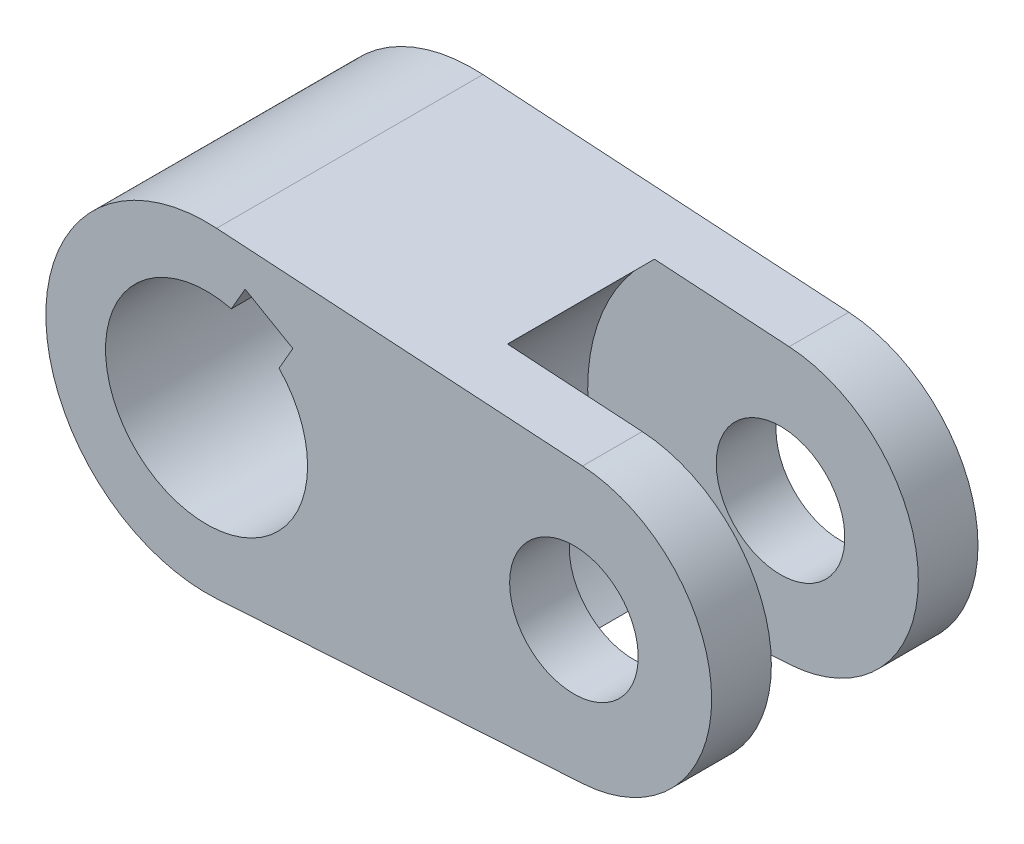
ISO-10303-21;
HEADER;
FILE_DESCRIPTION(('STEP AP214'),'2;1');
FILE_NAME('part.step','',(''),(''),'','','');
FILE_SCHEMA(('AUTOMOTIVE_DESIGN { 1 0 10303 214 1 1 1 1 }'));
ENDSEC;
DATA;
#1=APPLICATION_CONTEXT('core data for automotive mechanical design processes');
#2=APPLICATION_PROTOCOL_DEFINITION('international standard','automotive_design',2000,#1);
#3=PRODUCT_CONTEXT('',#1,'mechanical');
#4=PRODUCT('Part','Part','',(#3));
#5=PRODUCT_RELATED_PRODUCT_CATEGORY('part','',(#4));
#6=PRODUCT_DEFINITION_FORMATION('','',#4);
#7=PRODUCT_DEFINITION_CONTEXT('part definition',#1,'design');
#8=PRODUCT_DEFINITION('design','',#6,#7);
#9=PRODUCT_DEFINITION_SHAPE('','',#8);
#10=(LENGTH_UNIT() NAMED_UNIT(*) SI_UNIT(.MILLI.,.METRE.));
#11=(NAMED_UNIT(*) PLANE_ANGLE_UNIT() SI_UNIT($,.RADIAN.));
#12=(NAMED_UNIT(*) SI_UNIT($,.STERADIAN.) SOLID_ANGLE_UNIT());
#13=UNCERTAINTY_MEASURE_WITH_UNIT(LENGTH_MEASURE(1.E-05),#10,'distance_accuracy_value','');
#14=(GEOMETRIC_REPRESENTATION_CONTEXT(3) GLOBAL_UNCERTAINTY_ASSIGNED_CONTEXT((#13)) GLOBAL_UNIT_ASSIGNED_CONTEXT((#10,
#11,#12)) REPRESENTATION_CONTEXT('',''));
#15=CARTESIAN_POINT('',(0.,0.,0.));
#16=DIRECTION('',(0.,0.,1.));
#17=DIRECTION('',(1.,0.,0.));
#18=AXIS2_PLACEMENT_3D('',#15,#16,#17);
#19=CARTESIAN_POINT('',(40.,0.,14.5));
#20=DIRECTION('',(0.,0.,-1.));
#21=DIRECTION('',(-1.,0.,0.));
#22=AXIS2_PLACEMENT_3D('',#19,#20,#21);
#23=CYLINDRICAL_SURFACE('',#22,15.);
#24=CARTESIAN_POINT('',(40.,0.,-8.));
#25=DIRECTION('',(0.,0.,1.));
#26=DIRECTION('',(1.,0.,0.));
#27=AXIS2_PLACEMENT_3D('',#24,#25,#26);
#28=CIRCLE('',#27,15.);
#29=CARTESIAN_POINT('',(40.9375,-14.9706744587544,-8.));
#30=VERTEX_POINT('',#29);
#31=CARTESIAN_POINT('',(40.9375,14.9706744587544,-8.));
#32=VERTEX_POINT('',#31);
#33=EDGE_CURVE('E150',#30,#32,#28,.T.);
#34=ORIENTED_EDGE('',*,*,#33,.F.);
#35=DIRECTION('',(0.,0.,-1.));
#36=VECTOR('',#35,1.);
#37=CARTESIAN_POINT('',(40.9375,-14.9706744587544,14.5));
#38=LINE('',#37,#36);
#39=CARTESIAN_POINT('',(40.9375,-14.9706744587544,-14.5));
#40=VERTEX_POINT('',#39);
#41=EDGE_CURVE('E198',#30,#40,#38,.T.);
#42=ORIENTED_EDGE('',*,*,#41,.T.);
#43=CARTESIAN_POINT('',(40.,0.,-14.5));
#44=DIRECTION('',(0.,0.,1.));
#45=DIRECTION('',(1.,0.,0.));
#46=AXIS2_PLACEMENT_3D('',#43,#44,#45);
#47=CIRCLE('',#46,15.);
#48=CARTESIAN_POINT('',(40.9375,14.9706744587544,-14.5));
#49=VERTEX_POINT('',#48);
#50=EDGE_CURVE('E187',#40,#49,#47,.T.);
#51=ORIENTED_EDGE('',*,*,#50,.T.);
#52=DIRECTION('',(0.,0.,-1.));
#53=VECTOR('',#52,1.);
#54=CARTESIAN_POINT('',(40.9375,14.9706744587544,14.5));
#55=LINE('',#54,#53);
#56=EDGE_CURVE('E216',#32,#49,#55,.T.);
#57=ORIENTED_EDGE('',*,*,#56,.F.);
#58=EDGE_LOOP('',(#34,#42,#51,#57));
#59=FACE_BOUND('',#58,.T.);
#60=ADVANCED_FACE('F33',(#59),#23,.T.);
#61=CARTESIAN_POINT('',(40.9375,14.9706744587544,14.5));
#62=DIRECTION('',(-0.0625,-0.998044963916957,0.));
#63=DIRECTION('',(0.998044963916957,-0.0625,0.));
#64=AXIS2_PLACEMENT_3D('',#61,#62,#63);
#65=PLANE('',#64);
#66=DIRECTION('',(-0.998044963916957,0.0625,0.));
#67=VECTOR('',#66,1.);
#68=CARTESIAN_POINT('',(40.9375,14.9706744587544,-8.));
#69=LINE('',#68,#67);
#70=CARTESIAN_POINT('',(26.269294588294,15.889233112298,-8.));
#71=VERTEX_POINT('',#70);
#72=EDGE_CURVE('E133',#32,#71,#69,.T.);
#73=ORIENTED_EDGE('',*,*,#72,.F.);
#74=ORIENTED_EDGE('',*,*,#56,.T.);
#75=DIRECTION('',(-0.998044963916957,0.0625,0.));
#76=VECTOR('',#75,1.);
#77=CARTESIAN_POINT('',(40.9375,14.9706744587544,-14.5));
#78=LINE('',#77,#76);
#79=CARTESIAN_POINT('',(1.09375,17.4657868685467,-14.5));
#80=VERTEX_POINT('',#79);
#81=EDGE_CURVE('E201',#49,#80,#78,.T.);
#82=ORIENTED_EDGE('',*,*,#81,.T.);
#83=DIRECTION('',(0.,0.,-1.));
#84=VECTOR('',#83,1.);
#85=CARTESIAN_POINT('',(1.09375,17.4657868685467,14.5));
#86=LINE('',#85,#84);
#87=CARTESIAN_POINT('',(1.09375,17.4657868685467,14.5));
#88=VERTEX_POINT('',#87);
#89=EDGE_CURVE('E213',#88,#80,#86,.T.);
#90=ORIENTED_EDGE('',*,*,#89,.F.);
#91=DIRECTION('',(-0.998044963916957,0.0625,0.));
#92=VECTOR('',#91,1.);
#93=CARTESIAN_POINT('',(40.9375,14.9706744587544,14.5));
#94=LINE('',#93,#92);
#95=CARTESIAN_POINT('',(40.9375,14.9706744587544,14.5));
#96=VERTEX_POINT('',#95);
#97=EDGE_CURVE('E191',#96,#88,#94,.T.);
#98=ORIENTED_EDGE('',*,*,#97,.F.);
#99=CARTESIAN_POINT('',(40.9375,14.9706744587544,8.));
#100=VERTEX_POINT('',#99);
#101=EDGE_CURVE('E41',#96,#100,#55,.T.);
#102=ORIENTED_EDGE('',*,*,#101,.T.);
#103=DIRECTION('',(-0.998044963916957,0.0625,0.));
#104=VECTOR('',#103,1.);
#105=CARTESIAN_POINT('',(40.9375,14.9706744587544,8.));
#106=LINE('',#105,#104);
#107=CARTESIAN_POINT('',(26.269294588294,15.889233112298,8.));
#108=VERTEX_POINT('',#107);
#109=EDGE_CURVE('E136',#100,#108,#106,.T.);
#110=ORIENTED_EDGE('',*,*,#109,.T.);
#111=DIRECTION('',(0.,0.,1.));
#112=VECTOR('',#111,1.);
#113=CARTESIAN_POINT('',(26.2692945882941,15.889233112298,-8.));
#114=LINE('',#113,#112);
#115=EDGE_CURVE('E123',#108,#71,#114,.F.);
#116=ORIENTED_EDGE('',*,*,#115,.T.);
#117=EDGE_LOOP('',(#73,#74,#82,#90,#98,#102,#110,#116));
#118=FACE_BOUND('',#117,.T.);
#119=ADVANCED_FACE('F140',(#118),#65,.F.);
#120=CARTESIAN_POINT('',(40.9375,-14.9706744587544,14.5));
#121=DIRECTION('',(-0.0625000000000001,0.998044963916957,0.));
#122=DIRECTION('',(-0.998044963916957,-0.0625000000000001,0.));
#123=AXIS2_PLACEMENT_3D('',#120,#121,#122);
#124=PLANE('',#123);
#125=DIRECTION('',(0.998044963916957,0.0625000000000001,0.));
#126=VECTOR('',#125,1.);
#127=CARTESIAN_POINT('',(40.9375,-14.9706744587544,-8.));
#128=LINE('',#127,#126);
#129=CARTESIAN_POINT('',(26.2692945882941,-15.8892331122981,-8.));
#130=VERTEX_POINT('',#129);
#131=EDGE_CURVE('E145',#130,#30,#128,.T.);
#132=ORIENTED_EDGE('',*,*,#131,.F.);
#133=DIRECTION('',(0.,0.,1.));
#134=VECTOR('',#133,1.);
#135=CARTESIAN_POINT('',(26.2692945882941,-15.889233112298,-8.));
#136=LINE('',#135,#134);
#137=CARTESIAN_POINT('',(26.2692945882941,-15.8892331122981,8.));
#138=VERTEX_POINT('',#137);
#139=EDGE_CURVE('E11',#130,#138,#136,.T.);
#140=ORIENTED_EDGE('',*,*,#139,.T.);
#141=DIRECTION('',(0.998044963916957,0.0625000000000001,0.));
#142=VECTOR('',#141,1.);
#143=CARTESIAN_POINT('',(40.9375,-14.9706744587544,8.));
#144=LINE('',#143,#142);
#145=CARTESIAN_POINT('',(40.9375,-14.9706744587544,8.));
#146=VERTEX_POINT('',#145);
#147=EDGE_CURVE('E137',#138,#146,#144,.T.);
#148=ORIENTED_EDGE('',*,*,#147,.T.);
#149=CARTESIAN_POINT('',(40.9375,-14.9706744587544,14.5));
#150=VERTEX_POINT('',#149);
#151=EDGE_CURVE('E207',#150,#146,#38,.T.);
#152=ORIENTED_EDGE('',*,*,#151,.F.);
#153=DIRECTION('',(0.998044963916957,0.0625000000000001,0.));
#154=VECTOR('',#153,1.);
#155=CARTESIAN_POINT('',(40.9375,-14.9706744587544,14.5));
#156=LINE('',#155,#154);
#157=CARTESIAN_POINT('',(1.09374999999999,-17.4657868685468,14.5));
#158=VERTEX_POINT('',#157);
#159=EDGE_CURVE('E196',#158,#150,#156,.T.);
#160=ORIENTED_EDGE('',*,*,#159,.F.);
#161=DIRECTION('',(0.,0.,-1.));
#162=VECTOR('',#161,1.);
#163=CARTESIAN_POINT('',(1.09374999999999,-17.4657868685468,14.5));
#164=LINE('',#163,#162);
#165=CARTESIAN_POINT('',(1.09374999999999,-17.4657868685468,-14.5));
#166=VERTEX_POINT('',#165);
#167=EDGE_CURVE('E210',#158,#166,#164,.T.);
#168=ORIENTED_EDGE('',*,*,#167,.T.);
#169=DIRECTION('',(0.998044963916957,0.0625000000000001,0.));
#170=VECTOR('',#169,1.);
#171=CARTESIAN_POINT('',(40.9375,-14.9706744587544,-14.5));
#172=LINE('',#171,#170);
#173=EDGE_CURVE('E192',#166,#40,#172,.T.);
#174=ORIENTED_EDGE('',*,*,#173,.T.);
#175=ORIENTED_EDGE('',*,*,#41,.F.);
#176=EDGE_LOOP('',(#132,#140,#148,#152,#160,#168,#174,#175));
#177=FACE_BOUND('',#176,.T.);
#178=ADVANCED_FACE('F229',(#177),#124,.F.);
#179=CARTESIAN_POINT('',(40.,0.,14.5));
#180=DIRECTION('',(0.,0.,-1.));
#181=DIRECTION('',(-1.,0.,0.));
#182=AXIS2_PLACEMENT_3D('',#179,#180,#181);
#183=CYLINDRICAL_SURFACE('',#182,7.);
#184=CARTESIAN_POINT('',(40.,0.,-14.5));
#185=DIRECTION('',(0.,0.,1.));
#186=DIRECTION('',(1.,0.,0.));
#187=AXIS2_PLACEMENT_3D('',#184,#185,#186);
#188=CIRCLE('',#187,7.);
#189=CARTESIAN_POINT('',(33.,0.,-14.5));
#190=VERTEX_POINT('',#189);
#191=EDGE_CURVE('E132',#190,#190,#188,.T.);
#192=CARTESIAN_POINT('',(40.,0.,-8.));
#193=DIRECTION('',(0.,0.,1.));
#194=DIRECTION('',(1.,0.,0.));
#195=AXIS2_PLACEMENT_3D('',#192,#193,#194);
#196=CIRCLE('',#195,7.);
#197=CARTESIAN_POINT('',(33.,0.,-8.));
#198=VERTEX_POINT('',#197);
#199=EDGE_CURVE('E142',#198,#198,#196,.T.);
#200=CARTESIAN_POINT('',(33.,0.,-14.5));
#201=CARTESIAN_POINT('',(33.,0.,-14.4322916666667));
#202=CARTESIAN_POINT('',(33.,0.,-14.3645833333333));
#203=CARTESIAN_POINT('',(33.,0.,-14.2291666666667));
#204=CARTESIAN_POINT('',(33.,0.,-14.1614583333333));
#205=CARTESIAN_POINT('',(33.,0.,-14.0260416666667));
#206=CARTESIAN_POINT('',(33.,0.,-13.9583333333333));
#207=CARTESIAN_POINT('',(33.,0.,-13.8229166666667));
#208=CARTESIAN_POINT('',(33.,0.,-13.7552083333333));
#209=CARTESIAN_POINT('',(33.,0.,-13.6197916666667));
#210=CARTESIAN_POINT('',(33.,0.,-13.5520833333333));
#211=CARTESIAN_POINT('',(33.,0.,-13.4166666666667));
#212=CARTESIAN_POINT('',(33.,0.,-13.3489583333333));
#213=CARTESIAN_POINT('',(33.,0.,-13.2135416666667));
#214=CARTESIAN_POINT('',(33.,0.,-13.1458333333333));
#215=CARTESIAN_POINT('',(33.,0.,-13.0104166666667));
#216=CARTESIAN_POINT('',(33.,0.,-12.9427083333333));
#217=CARTESIAN_POINT('',(33.,0.,-12.8072916666667));
#218=CARTESIAN_POINT('',(33.,0.,-12.7395833333333));
#219=CARTESIAN_POINT('',(33.,0.,-12.6041666666667));
#220=CARTESIAN_POINT('',(33.,0.,-12.5364583333333));
#221=CARTESIAN_POINT('',(33.,0.,-12.4010416666667));
#222=CARTESIAN_POINT('',(33.,0.,-12.3333333333333));
#223=CARTESIAN_POINT('',(33.,0.,-12.1979166666667));
#224=CARTESIAN_POINT('',(33.,0.,-12.1302083333333));
#225=CARTESIAN_POINT('',(33.,0.,-11.9947916666667));
#226=CARTESIAN_POINT('',(33.,0.,-11.9270833333333));
#227=CARTESIAN_POINT('',(33.,0.,-11.7916666666667));
#228=CARTESIAN_POINT('',(33.,0.,-11.7239583333333));
#229=CARTESIAN_POINT('',(33.,0.,-11.5885416666667));
#230=CARTESIAN_POINT('',(33.,0.,-11.5208333333333));
#231=CARTESIAN_POINT('',(33.,0.,-11.3854166666667));
#232=CARTESIAN_POINT('',(33.,0.,-11.3177083333333));
#233=CARTESIAN_POINT('',(33.,0.,-11.1822916666667));
#234=CARTESIAN_POINT('',(33.,0.,-11.1145833333333));
#235=CARTESIAN_POINT('',(33.,0.,-10.9791666666667));
#236=CARTESIAN_POINT('',(33.,0.,-10.9114583333333));
#237=CARTESIAN_POINT('',(33.,0.,-10.7760416666667));
#238=CARTESIAN_POINT('',(33.,0.,-10.7083333333333));
#239=CARTESIAN_POINT('',(33.,0.,-10.5729166666667));
#240=CARTESIAN_POINT('',(33.,0.,-10.5052083333333));
#241=CARTESIAN_POINT('',(33.,0.,-10.3697916666667));
#242=CARTESIAN_POINT('',(33.,0.,-10.3020833333333));
#243=CARTESIAN_POINT('',(33.,0.,-10.1666666666667));
#244=CARTESIAN_POINT('',(33.,0.,-10.0989583333333));
#245=CARTESIAN_POINT('',(33.,0.,-9.96354166666667));
#246=CARTESIAN_POINT('',(33.,0.,-9.89583333333333));
#247=CARTESIAN_POINT('',(33.,0.,-9.76041666666667));
#248=CARTESIAN_POINT('',(33.,0.,-9.69270833333334));
#249=CARTESIAN_POINT('',(33.,0.,-9.55729166666667));
#250=CARTESIAN_POINT('',(33.,0.,-9.48958333333334));
#251=CARTESIAN_POINT('',(33.,0.,-9.35416666666667));
#252=CARTESIAN_POINT('',(33.,0.,-9.28645833333333));
#253=CARTESIAN_POINT('',(33.,0.,-9.15104166666667));
#254=CARTESIAN_POINT('',(33.,0.,-9.08333333333333));
#255=CARTESIAN_POINT('',(33.,0.,-8.94791666666667));
#256=CARTESIAN_POINT('',(33.,0.,-8.88020833333334));
#257=CARTESIAN_POINT('',(33.,0.,-8.74479166666667));
#258=CARTESIAN_POINT('',(33.,0.,-8.67708333333334));
#259=CARTESIAN_POINT('',(33.,0.,-8.54166666666667));
#260=CARTESIAN_POINT('',(33.,0.,-8.47395833333334));
#261=CARTESIAN_POINT('',(33.,0.,-8.33854166666667));
#262=CARTESIAN_POINT('',(33.,0.,-8.27083333333334));
#263=CARTESIAN_POINT('',(33.,0.,-8.13541666666667));
#264=CARTESIAN_POINT('',(33.,0.,-8.06770833333333));
#265=CARTESIAN_POINT('',(33.,0.,-8.));
#266=B_SPLINE_CURVE_WITH_KNOTS('',3,(#200,#201,#202,#203,#204,#205,#206,#207,#208,#209,#210,
#211,#212,#213,#214,#215,#216,#217,#218,#219,#220,#221,#222,#223,#224,#225,#226,#227,#228,#229,
#230,#231,#232,#233,#234,#235,#236,#237,#238,#239,#240,#241,#242,#243,#244,#245,#246,#247,#248,
#249,#250,#251,#252,#253,#254,#255,#256,#257,#258,#259,#260,#261,#262,#263,#264,#265),
.UNSPECIFIED.,.F.,.F.,(4,2,2,2,2,2,2,2,2,2,2,2,2,2,2,2,2,2,2,2,2,2,2,2,2,2,2,2,2,2,2,2,4),(0.,
0.203124999999998,0.40625,0.609374999999999,0.812500000000001,1.015625,1.21875,1.421875,1.625,
1.828125,2.03125,2.234375,2.4375,2.640625,2.84375,3.046875,3.25,3.453125,3.65625,3.859375,
4.0625,4.265625,4.46875,4.671875,4.875,5.078125,5.28125,5.484375,5.6875,5.890625,6.09375,
6.296875,6.5),.UNSPECIFIED.);
#267=EDGE_CURVE('BSEAM266',#190,#198,#266,.T.);
#268=ORIENTED_EDGE('',*,*,#191,.F.);
#269=ORIENTED_EDGE('',*,*,#199,.T.);
#270=ORIENTED_EDGE('',*,*,#267,.T.);
#271=ORIENTED_EDGE('',*,*,#267,.F.);
#272=EDGE_LOOP('',(#268,#270,#269,#271));
#273=FACE_BOUND('',#272,.T.);
#274=ADVANCED_FACE('F266',(#273),#183,.F.);
#275=CARTESIAN_POINT('',(40.,0.,14.5));
#276=DIRECTION('',(0.,0.,1.));
#277=DIRECTION('',(1.,0.,0.));
#278=AXIS2_PLACEMENT_3D('',#275,#276,#277);
#279=PLANE('',#278);
#280=DIRECTION('',(-0.499999999999998,-0.86602540378444,0.));
#281=VECTOR('',#280,1.);
#282=CARTESIAN_POINT('',(2.69342641077584,10.6651513899117,14.5));
#283=LINE('',#282,#281);
#284=CARTESIAN_POINT('',(4.20192378864665,13.2779454914684,14.5));
#285=VERTEX_POINT('',#284);
#286=CARTESIAN_POINT('',(2.69342641077584,10.6651513899117,14.5));
#287=VERTEX_POINT('',#286);
#288=EDGE_CURVE('E161',#285,#287,#283,.T.);
#289=ORIENTED_EDGE('',*,*,#288,.F.);
#290=DIRECTION('',(-0.86602540378444,0.499999999999997,0.));
#291=VECTOR('',#290,1.);
#292=CARTESIAN_POINT('',(4.20192378864665,13.2779454914684,14.5));
#293=LINE('',#292,#291);
#294=CARTESIAN_POINT('',(9.39807621135329,10.2779454914684,14.5));
#295=VERTEX_POINT('',#294);
#296=EDGE_CURVE('E159',#295,#285,#293,.T.);
#297=ORIENTED_EDGE('',*,*,#296,.F.);
#298=DIRECTION('',(0.499999999999997,0.86602540378444,0.));
#299=VECTOR('',#298,1.);
#300=CARTESIAN_POINT('',(9.39807621135329,10.2779454914684,14.5));
#301=LINE('',#300,#299);
#302=CARTESIAN_POINT('',(7.88957883348247,7.66515138991171,14.5));
#303=VERTEX_POINT('',#302);
#304=EDGE_CURVE('E166',#303,#295,#301,.T.);
#305=ORIENTED_EDGE('',*,*,#304,.F.);
#306=CARTESIAN_POINT('',(0.,0.,14.5));
#307=DIRECTION('',(0.,0.,1.));
#308=DIRECTION('',(1.,0.,0.));
#309=AXIS2_PLACEMENT_3D('',#306,#307,#308);
#310=CIRCLE('',#309,11.);
#311=EDGE_CURVE('E164',#287,#303,#310,.T.);
#312=ORIENTED_EDGE('',*,*,#311,.F.);
#313=EDGE_LOOP('',(#289,#297,#305,#312));
#314=FACE_BOUND('',#313,.T.);
#315=CARTESIAN_POINT('',(40.,0.,14.5));
#316=DIRECTION('',(0.,0.,1.));
#317=DIRECTION('',(1.,0.,0.));
#318=AXIS2_PLACEMENT_3D('',#315,#316,#317);
#319=CIRCLE('',#318,15.);
#320=EDGE_CURVE('E188',#150,#96,#319,.T.);
#321=ORIENTED_EDGE('',*,*,#320,.T.);
#322=ORIENTED_EDGE('',*,*,#97,.T.);
#323=CARTESIAN_POINT('',(0.,0.,14.5));
#324=DIRECTION('',(0.,0.,1.));
#325=DIRECTION('',(1.,0.,0.));
#326=AXIS2_PLACEMENT_3D('',#323,#324,#325);
#327=CIRCLE('',#326,17.5);
#328=EDGE_CURVE('E194',#88,#158,#327,.T.);
#329=ORIENTED_EDGE('',*,*,#328,.T.);
#330=ORIENTED_EDGE('',*,*,#159,.T.);
#331=EDGE_LOOP('',(#321,#322,#329,#330));
#332=FACE_BOUND('',#331,.T.);
#333=CARTESIAN_POINT('',(40.,0.,14.5));
#334=DIRECTION('',(0.,0.,1.));
#335=DIRECTION('',(1.,0.,0.));
#336=AXIS2_PLACEMENT_3D('',#333,#334,#335);
#337=CIRCLE('',#336,7.);
#338=CARTESIAN_POINT('',(33.,0.,14.5));
#339=VERTEX_POINT('',#338);
#340=EDGE_CURVE('E153',#339,#339,#337,.T.);
#341=ORIENTED_EDGE('',*,*,#340,.F.);
#342=EDGE_LOOP('',(#341));
#343=FACE_BOUND('',#342,.T.);
#344=ADVANCED_FACE('F248',(#314,#332,#343),#279,.T.);
#345=CARTESIAN_POINT('',(40.,0.,-14.5));
#346=DIRECTION('',(0.,0.,1.));
#347=DIRECTION('',(1.,0.,0.));
#348=AXIS2_PLACEMENT_3D('',#345,#346,#347);
#349=PLANE('',#348);
#350=ORIENTED_EDGE('',*,*,#50,.F.);
#351=ORIENTED_EDGE('',*,*,#173,.F.);
#352=CARTESIAN_POINT('',(0.,0.,-14.5));
#353=DIRECTION('',(0.,0.,1.));
#354=DIRECTION('',(1.,0.,0.));
#355=AXIS2_PLACEMENT_3D('',#352,#353,#354);
#356=CIRCLE('',#355,17.5);
#357=EDGE_CURVE('E203',#80,#166,#356,.T.);
#358=ORIENTED_EDGE('',*,*,#357,.F.);
#359=ORIENTED_EDGE('',*,*,#81,.F.);
#360=EDGE_LOOP('',(#350,#351,#358,#359));
#361=FACE_BOUND('',#360,.T.);
#362=DIRECTION('',(-0.86602540378444,0.499999999999997,0.));
#363=VECTOR('',#362,1.);
#364=CARTESIAN_POINT('',(4.20192378864665,13.2779454914684,-14.5));
#365=LINE('',#364,#363);
#366=CARTESIAN_POINT('',(9.39807621135328,10.2779454914684,-14.5));
#367=VERTEX_POINT('',#366);
#368=CARTESIAN_POINT('',(4.20192378864665,13.2779454914684,-14.5));
#369=VERTEX_POINT('',#368);
#370=EDGE_CURVE('E156',#367,#369,#365,.T.);
#371=ORIENTED_EDGE('',*,*,#370,.T.);
#372=DIRECTION('',(-0.499999999999998,-0.86602540378444,0.));
#373=VECTOR('',#372,1.);
#374=CARTESIAN_POINT('',(2.69342641077584,10.6651513899117,-14.5));
#375=LINE('',#374,#373);
#376=CARTESIAN_POINT('',(2.69342641077584,10.6651513899117,-14.5));
#377=VERTEX_POINT('',#376);
#378=EDGE_CURVE('E171',#369,#377,#375,.T.);
#379=ORIENTED_EDGE('',*,*,#378,.T.);
#380=CARTESIAN_POINT('',(0.,0.,-14.5));
#381=DIRECTION('',(0.,0.,1.));
#382=DIRECTION('',(1.,0.,0.));
#383=AXIS2_PLACEMENT_3D('',#380,#381,#382);
#384=CIRCLE('',#383,11.);
#385=CARTESIAN_POINT('',(7.88957883348248,7.6651513899117,-14.5));
#386=VERTEX_POINT('',#385);
#387=EDGE_CURVE('E174',#377,#386,#384,.T.);
#388=ORIENTED_EDGE('',*,*,#387,.T.);
#389=DIRECTION('',(0.499999999999997,0.86602540378444,0.));
#390=VECTOR('',#389,1.);
#391=CARTESIAN_POINT('',(9.39807621135329,10.2779454914684,-14.5));
#392=LINE('',#391,#390);
#393=EDGE_CURVE('E162',#386,#367,#392,.T.);
#394=ORIENTED_EDGE('',*,*,#393,.T.);
#395=EDGE_LOOP('',(#371,#379,#388,#394));
#396=FACE_BOUND('',#395,.T.);
#397=ORIENTED_EDGE('',*,*,#191,.T.);
#398=EDGE_LOOP('',(#397));
#399=FACE_BOUND('',#398,.T.);
#400=ADVANCED_FACE('F238',(#361,#396,#399),#349,.F.);
#401=ORIENTED_EDGE('',*,*,#151,.T.);
#402=CARTESIAN_POINT('',(40.,0.,8.));
#403=DIRECTION('',(0.,0.,1.));
#404=DIRECTION('',(1.,0.,0.));
#405=AXIS2_PLACEMENT_3D('',#402,#403,#404);
#406=CIRCLE('',#405,15.);
#407=EDGE_CURVE('E48',#146,#100,#406,.T.);
#408=ORIENTED_EDGE('',*,*,#407,.T.);
#409=ORIENTED_EDGE('',*,*,#101,.F.);
#410=ORIENTED_EDGE('',*,*,#320,.F.);
#411=EDGE_LOOP('',(#401,#408,#409,#410));
#412=FACE_BOUND('',#411,.T.);
#413=ADVANCED_FACE('F35',(#412),#23,.T.);
#414=CARTESIAN_POINT('',(0.,0.,14.5));
#415=DIRECTION('',(0.,0.,-1.));
#416=DIRECTION('',(-1.,0.,0.));
#417=AXIS2_PLACEMENT_3D('',#414,#415,#416);
#418=CYLINDRICAL_SURFACE('',#417,17.5);
#419=ORIENTED_EDGE('',*,*,#357,.T.);
#420=ORIENTED_EDGE('',*,*,#167,.F.);
#421=ORIENTED_EDGE('',*,*,#328,.F.);
#422=ORIENTED_EDGE('',*,*,#89,.T.);
#423=EDGE_LOOP('',(#419,#420,#421,#422));
#424=FACE_BOUND('',#423,.T.);
#425=ADVANCED_FACE('F242',(#424),#418,.T.);
#426=CARTESIAN_POINT('',(4.20192378864665,13.2779454914684,14.5));
#427=DIRECTION('',(-0.499999999999997,-0.86602540378444,0.));
#428=DIRECTION('',(0.86602540378444,-0.499999999999997,0.));
#429=AXIS2_PLACEMENT_3D('',#426,#427,#428);
#430=PLANE('',#429);
#431=ORIENTED_EDGE('',*,*,#370,.F.);
#432=DIRECTION('',(0.,0.,-1.));
#433=VECTOR('',#432,1.);
#434=CARTESIAN_POINT('',(9.39807621135329,10.2779454914684,14.5));
#435=LINE('',#434,#433);
#436=EDGE_CURVE('E168',#295,#367,#435,.T.);
#437=ORIENTED_EDGE('',*,*,#436,.F.);
#438=ORIENTED_EDGE('',*,*,#296,.T.);
#439=DIRECTION('',(0.,0.,-1.));
#440=VECTOR('',#439,1.);
#441=CARTESIAN_POINT('',(4.20192378864665,13.2779454914684,14.5));
#442=LINE('',#441,#440);
#443=EDGE_CURVE('E184',#285,#369,#442,.T.);
#444=ORIENTED_EDGE('',*,*,#443,.T.);
#445=EDGE_LOOP('',(#431,#437,#438,#444));
#446=FACE_BOUND('',#445,.T.);
#447=ADVANCED_FACE('F256',(#446),#430,.T.);
#448=CARTESIAN_POINT('',(2.69342641077584,10.6651513899117,14.5));
#449=DIRECTION('',(0.86602540378444,-0.499999999999998,0.));
#450=DIRECTION('',(0.499999999999998,0.86602540378444,0.));
#451=AXIS2_PLACEMENT_3D('',#448,#449,#450);
#452=PLANE('',#451);
#453=ORIENTED_EDGE('',*,*,#378,.F.);
#454=ORIENTED_EDGE('',*,*,#443,.F.);
#455=ORIENTED_EDGE('',*,*,#288,.T.);
#456=DIRECTION('',(0.,0.,-1.));
#457=VECTOR('',#456,1.);
#458=CARTESIAN_POINT('',(2.69342641077584,10.6651513899117,14.5));
#459=LINE('',#458,#457);
#460=EDGE_CURVE('E182',#287,#377,#459,.T.);
#461=ORIENTED_EDGE('',*,*,#460,.T.);
#462=EDGE_LOOP('',(#453,#454,#455,#461));
#463=FACE_BOUND('',#462,.T.);
#464=ADVANCED_FACE('F274',(#463),#452,.T.);
#465=CARTESIAN_POINT('',(0.,0.,14.5));
#466=DIRECTION('',(0.,0.,-1.));
#467=DIRECTION('',(-1.,0.,0.));
#468=AXIS2_PLACEMENT_3D('',#465,#466,#467);
#469=CYLINDRICAL_SURFACE('',#468,11.);
#470=ORIENTED_EDGE('',*,*,#387,.F.);
#471=ORIENTED_EDGE('',*,*,#460,.F.);
#472=ORIENTED_EDGE('',*,*,#311,.T.);
#473=DIRECTION('',(0.,0.,-1.));
#474=VECTOR('',#473,1.);
#475=CARTESIAN_POINT('',(7.88957883348248,7.6651513899117,14.5));
#476=LINE('',#475,#474);
#477=EDGE_CURVE('E56',#303,#386,#476,.T.);
#478=ORIENTED_EDGE('',*,*,#477,.T.);
#479=EDGE_LOOP('',(#470,#471,#472,#478));
#480=FACE_BOUND('',#479,.T.);
#481=ADVANCED_FACE('F278',(#480),#469,.F.);
#482=CARTESIAN_POINT('',(9.39807621135329,10.2779454914684,14.5));
#483=DIRECTION('',(-0.86602540378444,0.499999999999997,0.));
#484=DIRECTION('',(-0.499999999999997,-0.86602540378444,0.));
#485=AXIS2_PLACEMENT_3D('',#482,#483,#484);
#486=PLANE('',#485);
#487=ORIENTED_EDGE('',*,*,#393,.F.);
#488=ORIENTED_EDGE('',*,*,#477,.F.);
#489=ORIENTED_EDGE('',*,*,#304,.T.);
#490=ORIENTED_EDGE('',*,*,#436,.T.);
#491=EDGE_LOOP('',(#487,#488,#489,#490));
#492=FACE_BOUND('',#491,.T.);
#493=ADVANCED_FACE('F282',(#492),#486,.T.);
#494=CARTESIAN_POINT('',(40.,0.,8.));
#495=DIRECTION('',(0.,0.,1.));
#496=DIRECTION('',(1.,0.,0.));
#497=AXIS2_PLACEMENT_3D('',#494,#495,#496);
#498=CIRCLE('',#497,7.);
#499=CARTESIAN_POINT('',(33.,0.,8.));
#500=VERTEX_POINT('',#499);
#501=EDGE_CURVE('E218',#500,#500,#498,.T.);
#502=CARTESIAN_POINT('',(33.,0.,8.));
#503=CARTESIAN_POINT('',(33.,0.,8.06770833333333));
#504=CARTESIAN_POINT('',(33.,0.,8.13541666666667));
#505=CARTESIAN_POINT('',(33.,0.,8.27083333333333));
#506=CARTESIAN_POINT('',(33.,0.,8.33854166666667));
#507=CARTESIAN_POINT('',(33.,0.,8.47395833333333));
#508=CARTESIAN_POINT('',(33.,0.,8.54166666666667));
#509=CARTESIAN_POINT('',(33.,0.,8.67708333333333));
#510=CARTESIAN_POINT('',(33.,0.,8.74479166666667));
#511=CARTESIAN_POINT('',(33.,0.,8.88020833333333));
#512=CARTESIAN_POINT('',(33.,0.,8.94791666666667));
#513=CARTESIAN_POINT('',(33.,0.,9.08333333333333));
#514=CARTESIAN_POINT('',(33.,0.,9.15104166666667));
#515=CARTESIAN_POINT('',(33.,0.,9.28645833333333));
#516=CARTESIAN_POINT('',(33.,0.,9.35416666666667));
#517=CARTESIAN_POINT('',(33.,0.,9.48958333333333));
#518=CARTESIAN_POINT('',(33.,0.,9.55729166666667));
#519=CARTESIAN_POINT('',(33.,0.,9.69270833333333));
#520=CARTESIAN_POINT('',(33.,0.,9.76041666666667));
#521=CARTESIAN_POINT('',(33.,0.,9.89583333333333));
#522=CARTESIAN_POINT('',(33.,0.,9.96354166666667));
#523=CARTESIAN_POINT('',(33.,0.,10.0989583333333));
#524=CARTESIAN_POINT('',(33.,0.,10.1666666666667));
#525=CARTESIAN_POINT('',(33.,0.,10.3020833333333));
#526=CARTESIAN_POINT('',(33.,0.,10.3697916666667));
#527=CARTESIAN_POINT('',(33.,0.,10.5052083333333));
#528=CARTESIAN_POINT('',(33.,0.,10.5729166666667));
#529=CARTESIAN_POINT('',(33.,0.,10.7083333333333));
#530=CARTESIAN_POINT('',(33.,0.,10.7760416666667));
#531=CARTESIAN_POINT('',(33.,0.,10.9114583333333));
#532=CARTESIAN_POINT('',(33.,0.,10.9791666666667));
#533=CARTESIAN_POINT('',(33.,0.,11.1145833333333));
#534=CARTESIAN_POINT('',(33.,0.,11.1822916666667));
#535=CARTESIAN_POINT('',(33.,0.,11.3177083333333));
#536=CARTESIAN_POINT('',(33.,0.,11.3854166666667));
#537=CARTESIAN_POINT('',(33.,0.,11.5208333333333));
#538=CARTESIAN_POINT('',(33.,0.,11.5885416666667));
#539=CARTESIAN_POINT('',(33.,0.,11.7239583333333));
#540=CARTESIAN_POINT('',(33.,0.,11.7916666666667));
#541=CARTESIAN_POINT('',(33.,0.,11.9270833333333));
#542=CARTESIAN_POINT('',(33.,0.,11.9947916666667));
#543=CARTESIAN_POINT('',(33.,0.,12.1302083333333));
#544=CARTESIAN_POINT('',(33.,0.,12.1979166666667));
#545=CARTESIAN_POINT('',(33.,0.,12.3333333333333));
#546=CARTESIAN_POINT('',(33.,0.,12.4010416666667));
#547=CARTESIAN_POINT('',(33.,0.,12.5364583333333));
#548=CARTESIAN_POINT('',(33.,0.,12.6041666666667));
#549=CARTESIAN_POINT('',(33.,0.,12.7395833333333));
#550=CARTESIAN_POINT('',(33.,0.,12.8072916666667));
#551=CARTESIAN_POINT('',(33.,0.,12.9427083333333));
#552=CARTESIAN_POINT('',(33.,0.,13.0104166666667));
#553=CARTESIAN_POINT('',(33.,0.,13.1458333333333));
#554=CARTESIAN_POINT('',(33.,0.,13.2135416666667));
#555=CARTESIAN_POINT('',(33.,0.,13.3489583333333));
#556=CARTESIAN_POINT('',(33.,0.,13.4166666666667));
#557=CARTESIAN_POINT('',(33.,0.,13.5520833333333));
#558=CARTESIAN_POINT('',(33.,0.,13.6197916666667));
#559=CARTESIAN_POINT('',(33.,0.,13.7552083333333));
#560=CARTESIAN_POINT('',(33.,0.,13.8229166666667));
#561=CARTESIAN_POINT('',(33.,0.,13.9583333333333));
#562=CARTESIAN_POINT('',(33.,0.,14.0260416666667));
#563=CARTESIAN_POINT('',(33.,0.,14.1614583333333));
#564=CARTESIAN_POINT('',(33.,0.,14.2291666666667));
#565=CARTESIAN_POINT('',(33.,0.,14.3645833333333));
#566=CARTESIAN_POINT('',(33.,0.,14.4322916666667));
#567=CARTESIAN_POINT('',(33.,0.,14.5));
#568=B_SPLINE_CURVE_WITH_KNOTS('',3,(#502,#503,#504,#505,#506,#507,#508,#509,#510,#511,#512,
#513,#514,#515,#516,#517,#518,#519,#520,#521,#522,#523,#524,#525,#526,#527,#528,#529,#530,#531,
#532,#533,#534,#535,#536,#537,#538,#539,#540,#541,#542,#543,#544,#545,#546,#547,#548,#549,#550,
#551,#552,#553,#554,#555,#556,#557,#558,#559,#560,#561,#562,#563,#564,#565,#566,#567),
.UNSPECIFIED.,.F.,.F.,(4,2,2,2,2,2,2,2,2,2,2,2,2,2,2,2,2,2,2,2,2,2,2,2,2,2,2,2,2,2,2,2,4),(0.,
0.203124999999998,0.40625,0.609374999999999,0.812499999999999,1.015625,1.21875,1.421875,1.625,
1.828125,2.03125,2.234375,2.4375,2.640625,2.84375,3.046875,3.25,3.453125,3.65625,3.859375,
4.0625,4.265625,4.46875,4.671875,4.875,5.078125,5.28125,5.484375,5.6875,5.890625,6.09375,
6.296875,6.5),.UNSPECIFIED.);
#569=EDGE_CURVE('BSEAM286',#500,#339,#568,.T.);
#570=ORIENTED_EDGE('',*,*,#501,.F.);
#571=ORIENTED_EDGE('',*,*,#340,.T.);
#572=ORIENTED_EDGE('',*,*,#569,.T.);
#573=ORIENTED_EDGE('',*,*,#569,.F.);
#574=EDGE_LOOP('',(#570,#572,#571,#573));
#575=FACE_BOUND('',#574,.T.);
#576=ADVANCED_FACE('F286',(#575),#183,.F.);
#577=CARTESIAN_POINT('',(40.,0.,-8.));
#578=DIRECTION('',(0.,0.,1.));
#579=DIRECTION('',(1.,0.,0.));
#580=AXIS2_PLACEMENT_3D('',#577,#578,#579);
#581=CYLINDRICAL_SURFACE('',#580,21.);
#582=CARTESIAN_POINT('',(40.,0.,8.));
#583=DIRECTION('',(0.,0.,1.));
#584=DIRECTION('',(1.,0.,0.));
#585=AXIS2_PLACEMENT_3D('',#582,#583,#584);
#586=CIRCLE('',#585,21.);
#587=EDGE_CURVE('E126',#108,#138,#586,.T.);
#588=ORIENTED_EDGE('',*,*,#587,.T.);
#589=ORIENTED_EDGE('',*,*,#139,.F.);
#590=CARTESIAN_POINT('',(40.,0.,-8.));
#591=DIRECTION('',(0.,0.,1.));
#592=DIRECTION('',(1.,0.,0.));
#593=AXIS2_PLACEMENT_3D('',#590,#591,#592);
#594=CIRCLE('',#593,21.);
#595=EDGE_CURVE('E128',#71,#130,#594,.T.);
#596=ORIENTED_EDGE('',*,*,#595,.F.);
#597=ORIENTED_EDGE('',*,*,#115,.F.);
#598=EDGE_LOOP('',(#588,#589,#596,#597));
#599=FACE_BOUND('',#598,.T.);
#600=ADVANCED_FACE('F125',(#599),#581,.F.);
#601=CARTESIAN_POINT('',(40.,0.,-8.));
#602=DIRECTION('',(0.,0.,1.));
#603=DIRECTION('',(1.,0.,0.));
#604=AXIS2_PLACEMENT_3D('',#601,#602,#603);
#605=PLANE('',#604);
#606=ORIENTED_EDGE('',*,*,#199,.F.);
#607=EDGE_LOOP('',(#606));
#608=FACE_BOUND('',#607,.T.);
#609=ORIENTED_EDGE('',*,*,#72,.T.);
#610=ORIENTED_EDGE('',*,*,#595,.T.);
#611=ORIENTED_EDGE('',*,*,#131,.T.);
#612=ORIENTED_EDGE('',*,*,#33,.T.);
#613=EDGE_LOOP('',(#609,#610,#611,#612));
#614=FACE_BOUND('',#613,.T.);
#615=ADVANCED_FACE('F225',(#608,#614),#605,.T.);
#616=CARTESIAN_POINT('',(40.,0.,8.));
#617=DIRECTION('',(0.,0.,1.));
#618=DIRECTION('',(1.,0.,0.));
#619=AXIS2_PLACEMENT_3D('',#616,#617,#618);
#620=PLANE('',#619);
#621=ORIENTED_EDGE('',*,*,#501,.T.);
#622=EDGE_LOOP('',(#621));
#623=FACE_BOUND('',#622,.T.);
#624=ORIENTED_EDGE('',*,*,#407,.F.);
#625=ORIENTED_EDGE('',*,*,#147,.F.);
#626=ORIENTED_EDGE('',*,*,#587,.F.);
#627=ORIENTED_EDGE('',*,*,#109,.F.);
#628=EDGE_LOOP('',(#624,#625,#626,#627));
#629=FACE_BOUND('',#628,.T.);
#630=ADVANCED_FACE('F135',(#623,#629),#620,.F.);
#631=CLOSED_SHELL('',(#60,#119,#178,#274,#344,#400,#413,#425,#447,#464,#481,#493,#576,#600,#615,#630));
#632=MANIFOLD_SOLID_BREP('B2',#631);
#633=ADVANCED_BREP_SHAPE_REPRESENTATION('',(#18,#632),#14);
#634=SHAPE_DEFINITION_REPRESENTATION(#9,#633);
ENDSEC;
END-ISO-10303-21;
